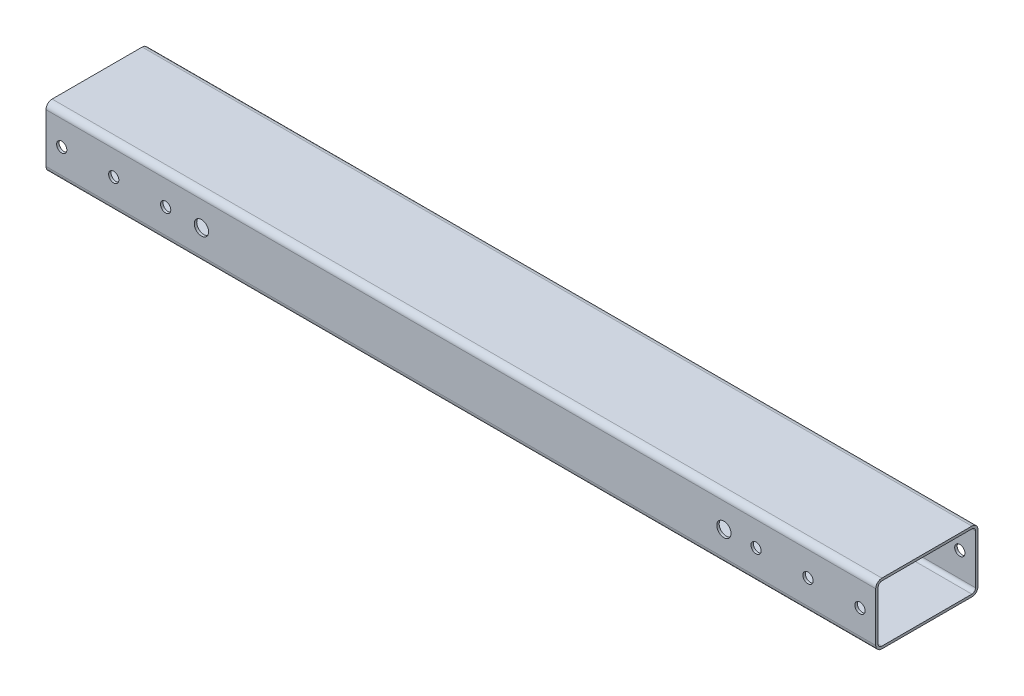
ISO-10303-21;
HEADER;
FILE_DESCRIPTION(('STEP AP214'),'2;1');
FILE_NAME('part.step','',(''),(''),'','','');
FILE_SCHEMA(('AUTOMOTIVE_DESIGN { 1 0 10303 214 1 1 1 1 }'));
ENDSEC;
DATA;
#1=APPLICATION_CONTEXT('core data for automotive mechanical design processes');
#2=APPLICATION_PROTOCOL_DEFINITION('international standard','automotive_design',2000,#1);
#3=PRODUCT_CONTEXT('',#1,'mechanical');
#4=PRODUCT('Part','Part','',(#3));
#5=PRODUCT_RELATED_PRODUCT_CATEGORY('part','',(#4));
#6=PRODUCT_DEFINITION_FORMATION('','',#4);
#7=PRODUCT_DEFINITION_CONTEXT('part definition',#1,'design');
#8=PRODUCT_DEFINITION('design','',#6,#7);
#9=PRODUCT_DEFINITION_SHAPE('','',#8);
#10=(LENGTH_UNIT() NAMED_UNIT(*) SI_UNIT(.MILLI.,.METRE.));
#11=(NAMED_UNIT(*) PLANE_ANGLE_UNIT() SI_UNIT($,.RADIAN.));
#12=(NAMED_UNIT(*) SI_UNIT($,.STERADIAN.) SOLID_ANGLE_UNIT());
#13=UNCERTAINTY_MEASURE_WITH_UNIT(LENGTH_MEASURE(1.E-05),#10,'distance_accuracy_value','');
#14=(GEOMETRIC_REPRESENTATION_CONTEXT(3) GLOBAL_UNCERTAINTY_ASSIGNED_CONTEXT((#13)) GLOBAL_UNIT_ASSIGNED_CONTEXT((#10,
#11,#12)) REPRESENTATION_CONTEXT('',''));
#15=CARTESIAN_POINT('',(0.,0.,0.));
#16=DIRECTION('',(0.,0.,1.));
#17=DIRECTION('',(1.,0.,0.));
#18=AXIS2_PLACEMENT_3D('',#15,#16,#17);
#19=CARTESIAN_POINT('',(405.6,12.,22.));
#20=DIRECTION('',(-1.,0.,0.));
#21=DIRECTION('',(0.,0.,1.));
#22=AXIS2_PLACEMENT_3D('',#19,#20,#21);
#23=CYLINDRICAL_SURFACE('',#22,3.);
#24=CARTESIAN_POINT('',(0.,12.,22.));
#25=DIRECTION('',(1.,0.,0.));
#26=DIRECTION('',(0.,0.,-1.));
#27=AXIS2_PLACEMENT_3D('',#24,#25,#26);
#28=CIRCLE('',#27,3.);
#29=CARTESIAN_POINT('',(0.,15.,22.));
#30=VERTEX_POINT('',#29);
#31=CARTESIAN_POINT('',(0.,12.,25.));
#32=VERTEX_POINT('',#31);
#33=EDGE_CURVE('E243',#30,#32,#28,.T.);
#34=ORIENTED_EDGE('',*,*,#33,.T.);
#35=DIRECTION('',(-1.,0.,0.));
#36=VECTOR('',#35,1.);
#37=CARTESIAN_POINT('',(405.6,12.,25.));
#38=LINE('',#37,#36);
#39=CARTESIAN_POINT('',(405.6,12.,25.));
#40=VERTEX_POINT('',#39);
#41=EDGE_CURVE('E12',#40,#32,#38,.T.);
#42=ORIENTED_EDGE('',*,*,#41,.F.);
#43=CARTESIAN_POINT('',(405.6,12.,22.));
#44=DIRECTION('',(1.,0.,0.));
#45=DIRECTION('',(0.,0.,-1.));
#46=AXIS2_PLACEMENT_3D('',#43,#44,#45);
#47=CIRCLE('',#46,3.);
#48=CARTESIAN_POINT('',(405.6,15.,22.));
#49=VERTEX_POINT('',#48);
#50=EDGE_CURVE('E401',#49,#40,#47,.T.);
#51=ORIENTED_EDGE('',*,*,#50,.F.);
#52=DIRECTION('',(-1.,0.,0.));
#53=VECTOR('',#52,1.);
#54=CARTESIAN_POINT('',(405.6,15.,22.));
#55=LINE('',#54,#53);
#56=EDGE_CURVE('E258',#49,#30,#55,.T.);
#57=ORIENTED_EDGE('',*,*,#56,.T.);
#58=EDGE_LOOP('',(#34,#42,#51,#57));
#59=FACE_BOUND('',#58,.T.);
#60=ADVANCED_FACE('F69',(#59),#23,.T.);
#61=CARTESIAN_POINT('',(405.6,12.,25.));
#62=DIRECTION('',(0.,0.,-1.));
#63=DIRECTION('',(-1.,0.,0.));
#64=AXIS2_PLACEMENT_3D('',#61,#62,#63);
#65=PLANE('',#64);
#66=CARTESIAN_POINT('',(75.9847050473196,1.11022302462516E-13,25.));
#67=DIRECTION('',(0.,0.,1.));
#68=DIRECTION('',(1.,0.,0.));
#69=AXIS2_PLACEMENT_3D('',#66,#67,#68);
#70=CIRCLE('',#69,3.50000000000002);
#71=CARTESIAN_POINT('',(79.4847050473196,1.11022302462516E-13,25.));
#72=VERTEX_POINT('',#71);
#73=EDGE_CURVE('E316',#72,#72,#70,.T.);
#74=ORIENTED_EDGE('',*,*,#73,.F.);
#75=EDGE_LOOP('',(#74));
#76=FACE_BOUND('',#75,.T.);
#77=CARTESIAN_POINT('',(331.38470504732,1.11022302462516E-13,25.));
#78=DIRECTION('',(0.,0.,1.));
#79=DIRECTION('',(1.,0.,0.));
#80=AXIS2_PLACEMENT_3D('',#77,#78,#79);
#81=CIRCLE('',#80,3.50000000000002);
#82=CARTESIAN_POINT('',(334.88470504732,1.11022302462516E-13,25.));
#83=VERTEX_POINT('',#82);
#84=EDGE_CURVE('E321',#83,#83,#81,.T.);
#85=ORIENTED_EDGE('',*,*,#84,.F.);
#86=EDGE_LOOP('',(#85));
#87=FACE_BOUND('',#86,.T.);
#88=CARTESIAN_POINT('',(33.1,0.,25.));
#89=DIRECTION('',(0.,0.,-1.));
#90=DIRECTION('',(-1.,0.,0.));
#91=AXIS2_PLACEMENT_3D('',#88,#89,#90);
#92=CIRCLE('',#91,2.5);
#93=CARTESIAN_POINT('',(30.6,0.,25.));
#94=VERTEX_POINT('',#93);
#95=EDGE_CURVE('E343',#94,#94,#92,.T.);
#96=ORIENTED_EDGE('',*,*,#95,.T.);
#97=EDGE_LOOP('',(#96));
#98=FACE_BOUND('',#97,.T.);
#99=CARTESIAN_POINT('',(7.7,0.,25.));
#100=DIRECTION('',(0.,0.,-1.));
#101=DIRECTION('',(-1.,0.,0.));
#102=AXIS2_PLACEMENT_3D('',#99,#100,#101);
#103=CIRCLE('',#102,2.5);
#104=CARTESIAN_POINT('',(5.2,0.,25.));
#105=VERTEX_POINT('',#104);
#106=EDGE_CURVE('E349',#105,#105,#103,.T.);
#107=ORIENTED_EDGE('',*,*,#106,.T.);
#108=EDGE_LOOP('',(#107));
#109=FACE_BOUND('',#108,.T.);
#110=CARTESIAN_POINT('',(397.9,0.,25.));
#111=DIRECTION('',(0.,0.,-1.));
#112=DIRECTION('',(1.,0.,0.));
#113=AXIS2_PLACEMENT_3D('',#110,#111,#112);
#114=CIRCLE('',#113,2.5000000000002);
#115=CARTESIAN_POINT('',(400.4,0.,25.));
#116=VERTEX_POINT('',#115);
#117=EDGE_CURVE('E355',#116,#116,#114,.T.);
#118=ORIENTED_EDGE('',*,*,#117,.T.);
#119=EDGE_LOOP('',(#118));
#120=FACE_BOUND('',#119,.T.);
#121=CARTESIAN_POINT('',(372.5,0.,25.));
#122=DIRECTION('',(0.,0.,-1.));
#123=DIRECTION('',(1.,0.,0.));
#124=AXIS2_PLACEMENT_3D('',#121,#122,#123);
#125=CIRCLE('',#124,2.50000000000002);
#126=CARTESIAN_POINT('',(375.,0.,25.));
#127=VERTEX_POINT('',#126);
#128=EDGE_CURVE('E336',#127,#127,#125,.T.);
#129=ORIENTED_EDGE('',*,*,#128,.T.);
#130=EDGE_LOOP('',(#129));
#131=FACE_BOUND('',#130,.T.);
#132=CARTESIAN_POINT('',(347.1,0.,25.));
#133=DIRECTION('',(0.,0.,-1.));
#134=DIRECTION('',(1.,0.,0.));
#135=AXIS2_PLACEMENT_3D('',#132,#133,#134);
#136=CIRCLE('',#135,2.50000000000002);
#137=CARTESIAN_POINT('',(349.6,0.,25.));
#138=VERTEX_POINT('',#137);
#139=EDGE_CURVE('E332',#138,#138,#136,.T.);
#140=ORIENTED_EDGE('',*,*,#139,.T.);
#141=EDGE_LOOP('',(#140));
#142=FACE_BOUND('',#141,.T.);
#143=CARTESIAN_POINT('',(58.5,0.,25.));
#144=DIRECTION('',(0.,0.,-1.));
#145=DIRECTION('',(-1.,0.,0.));
#146=AXIS2_PLACEMENT_3D('',#143,#144,#145);
#147=CIRCLE('',#146,2.5);
#148=CARTESIAN_POINT('',(56.,0.,25.));
#149=VERTEX_POINT('',#148);
#150=EDGE_CURVE('E288',#149,#149,#147,.T.);
#151=ORIENTED_EDGE('',*,*,#150,.T.);
#152=EDGE_LOOP('',(#151));
#153=FACE_BOUND('',#152,.T.);
#154=DIRECTION('',(0.,-1.,0.));
#155=VECTOR('',#154,1.);
#156=CARTESIAN_POINT('',(0.,12.,25.));
#157=LINE('',#156,#155);
#158=CARTESIAN_POINT('',(0.,-12.,25.));
#159=VERTEX_POINT('',#158);
#160=EDGE_CURVE('E246',#32,#159,#157,.T.);
#161=ORIENTED_EDGE('',*,*,#160,.T.);
#162=DIRECTION('',(-1.,0.,0.));
#163=VECTOR('',#162,1.);
#164=CARTESIAN_POINT('',(405.6,-12.,25.));
#165=LINE('',#164,#163);
#166=CARTESIAN_POINT('',(405.6,-12.,25.));
#167=VERTEX_POINT('',#166);
#168=EDGE_CURVE('E79',#167,#159,#165,.T.);
#169=ORIENTED_EDGE('',*,*,#168,.F.);
#170=DIRECTION('',(0.,-1.,0.));
#171=VECTOR('',#170,1.);
#172=CARTESIAN_POINT('',(405.6,12.,25.));
#173=LINE('',#172,#171);
#174=EDGE_CURVE('E403',#40,#167,#173,.T.);
#175=ORIENTED_EDGE('',*,*,#174,.F.);
#176=ORIENTED_EDGE('',*,*,#41,.T.);
#177=EDGE_LOOP('',(#161,#169,#175,#176));
#178=FACE_BOUND('',#177,.T.);
#179=ADVANCED_FACE('F441',(#76,#87,#98,#109,#120,#131,#142,#153,#178),#65,.F.);
#180=CARTESIAN_POINT('',(405.6,-12.,22.));
#181=DIRECTION('',(-1.,0.,0.));
#182=DIRECTION('',(0.,0.,1.));
#183=AXIS2_PLACEMENT_3D('',#180,#181,#182);
#184=CYLINDRICAL_SURFACE('',#183,3.);
#185=CARTESIAN_POINT('',(0.,-12.,22.));
#186=DIRECTION('',(1.,0.,0.));
#187=DIRECTION('',(0.,0.,-1.));
#188=AXIS2_PLACEMENT_3D('',#185,#186,#187);
#189=CIRCLE('',#188,3.);
#190=CARTESIAN_POINT('',(0.,-15.,22.));
#191=VERTEX_POINT('',#190);
#192=EDGE_CURVE('E248',#159,#191,#189,.T.);
#193=ORIENTED_EDGE('',*,*,#192,.T.);
#194=DIRECTION('',(-1.,0.,0.));
#195=VECTOR('',#194,1.);
#196=CARTESIAN_POINT('',(405.6,-15.,22.));
#197=LINE('',#196,#195);
#198=CARTESIAN_POINT('',(405.6,-15.,22.));
#199=VERTEX_POINT('',#198);
#200=EDGE_CURVE('E265',#199,#191,#197,.T.);
#201=ORIENTED_EDGE('',*,*,#200,.F.);
#202=CARTESIAN_POINT('',(405.6,-12.,22.));
#203=DIRECTION('',(1.,0.,0.));
#204=DIRECTION('',(0.,0.,-1.));
#205=AXIS2_PLACEMENT_3D('',#202,#203,#204);
#206=CIRCLE('',#205,3.);
#207=EDGE_CURVE('E405',#167,#199,#206,.T.);
#208=ORIENTED_EDGE('',*,*,#207,.F.);
#209=ORIENTED_EDGE('',*,*,#168,.T.);
#210=EDGE_LOOP('',(#193,#201,#208,#209));
#211=FACE_BOUND('',#210,.T.);
#212=ADVANCED_FACE('F447',(#211),#184,.T.);
#213=CARTESIAN_POINT('',(405.6,-15.,-22.));
#214=DIRECTION('',(0.,1.,0.));
#215=DIRECTION('',(0.,0.,1.));
#216=AXIS2_PLACEMENT_3D('',#213,#214,#215);
#217=PLANE('',#216);
#218=DIRECTION('',(0.,0.,-1.));
#219=VECTOR('',#218,1.);
#220=CARTESIAN_POINT('',(0.,-15.,-22.));
#221=LINE('',#220,#219);
#222=CARTESIAN_POINT('',(0.,-15.,-22.));
#223=VERTEX_POINT('',#222);
#224=EDGE_CURVE('E250',#191,#223,#221,.T.);
#225=ORIENTED_EDGE('',*,*,#224,.T.);
#226=DIRECTION('',(-1.,0.,0.));
#227=VECTOR('',#226,1.);
#228=CARTESIAN_POINT('',(405.6,-15.,-22.));
#229=LINE('',#228,#227);
#230=CARTESIAN_POINT('',(405.6,-15.,-22.));
#231=VERTEX_POINT('',#230);
#232=EDGE_CURVE('E262',#231,#223,#229,.T.);
#233=ORIENTED_EDGE('',*,*,#232,.F.);
#234=DIRECTION('',(0.,0.,-1.));
#235=VECTOR('',#234,1.);
#236=CARTESIAN_POINT('',(405.6,-15.,-22.));
#237=LINE('',#236,#235);
#238=EDGE_CURVE('E407',#199,#231,#237,.T.);
#239=ORIENTED_EDGE('',*,*,#238,.F.);
#240=ORIENTED_EDGE('',*,*,#200,.T.);
#241=EDGE_LOOP('',(#225,#233,#239,#240));
#242=FACE_BOUND('',#241,.T.);
#243=ADVANCED_FACE('F413',(#242),#217,.F.);
#244=CARTESIAN_POINT('',(405.6,-12.,-22.));
#245=DIRECTION('',(-1.,0.,0.));
#246=DIRECTION('',(0.,0.,1.));
#247=AXIS2_PLACEMENT_3D('',#244,#245,#246);
#248=CYLINDRICAL_SURFACE('',#247,3.);
#249=CARTESIAN_POINT('',(0.,-12.,-22.));
#250=DIRECTION('',(1.,0.,0.));
#251=DIRECTION('',(0.,0.,-1.));
#252=AXIS2_PLACEMENT_3D('',#249,#250,#251);
#253=CIRCLE('',#252,3.);
#254=CARTESIAN_POINT('',(0.,-12.,-25.));
#255=VERTEX_POINT('',#254);
#256=EDGE_CURVE('E252',#223,#255,#253,.T.);
#257=ORIENTED_EDGE('',*,*,#256,.T.);
#258=DIRECTION('',(-1.,0.,0.));
#259=VECTOR('',#258,1.);
#260=CARTESIAN_POINT('',(405.6,-12.,-25.));
#261=LINE('',#260,#259);
#262=CARTESIAN_POINT('',(405.6,-12.,-25.));
#263=VERTEX_POINT('',#262);
#264=EDGE_CURVE('E209',#263,#255,#261,.T.);
#265=ORIENTED_EDGE('',*,*,#264,.F.);
#266=CARTESIAN_POINT('',(405.6,-12.,-22.));
#267=DIRECTION('',(1.,0.,0.));
#268=DIRECTION('',(0.,0.,-1.));
#269=AXIS2_PLACEMENT_3D('',#266,#267,#268);
#270=CIRCLE('',#269,3.);
#271=EDGE_CURVE('E200',#231,#263,#270,.T.);
#272=ORIENTED_EDGE('',*,*,#271,.F.);
#273=ORIENTED_EDGE('',*,*,#232,.T.);
#274=EDGE_LOOP('',(#257,#265,#272,#273));
#275=FACE_BOUND('',#274,.T.);
#276=ADVANCED_FACE('F417',(#275),#248,.T.);
#277=CARTESIAN_POINT('',(405.6,-12.,-25.));
#278=DIRECTION('',(0.,0.,1.));
#279=DIRECTION('',(1.,0.,0.));
#280=AXIS2_PLACEMENT_3D('',#277,#278,#279);
#281=PLANE('',#280);
#282=CARTESIAN_POINT('',(75.9847050473196,1.11022302462516E-13,-25.));
#283=DIRECTION('',(0.,0.,1.));
#284=DIRECTION('',(1.,0.,0.));
#285=AXIS2_PLACEMENT_3D('',#282,#283,#284);
#286=CIRCLE('',#285,3.50000000000002);
#287=CARTESIAN_POINT('',(79.4847050473196,1.11022302462516E-13,-25.));
#288=VERTEX_POINT('',#287);
#289=EDGE_CURVE('E310',#288,#288,#286,.T.);
#290=ORIENTED_EDGE('',*,*,#289,.T.);
#291=EDGE_LOOP('',(#290));
#292=FACE_BOUND('',#291,.T.);
#293=CARTESIAN_POINT('',(331.38470504732,1.11022302462516E-13,-25.));
#294=DIRECTION('',(0.,0.,1.));
#295=DIRECTION('',(1.,0.,0.));
#296=AXIS2_PLACEMENT_3D('',#293,#294,#295);
#297=CIRCLE('',#296,3.50000000000002);
#298=CARTESIAN_POINT('',(334.88470504732,1.11022302462516E-13,-25.));
#299=VERTEX_POINT('',#298);
#300=EDGE_CURVE('E326',#299,#299,#297,.T.);
#301=ORIENTED_EDGE('',*,*,#300,.T.);
#302=EDGE_LOOP('',(#301));
#303=FACE_BOUND('',#302,.T.);
#304=CARTESIAN_POINT('',(33.1,0.,-25.));
#305=DIRECTION('',(0.,0.,-1.));
#306=DIRECTION('',(-1.,0.,0.));
#307=AXIS2_PLACEMENT_3D('',#304,#305,#306);
#308=CIRCLE('',#307,2.5);
#309=CARTESIAN_POINT('',(30.6,0.,-25.));
#310=VERTEX_POINT('',#309);
#311=EDGE_CURVE('E339',#310,#310,#308,.T.);
#312=ORIENTED_EDGE('',*,*,#311,.F.);
#313=EDGE_LOOP('',(#312));
#314=FACE_BOUND('',#313,.T.);
#315=CARTESIAN_POINT('',(7.7,0.,-25.));
#316=DIRECTION('',(0.,0.,-1.));
#317=DIRECTION('',(-1.,0.,0.));
#318=AXIS2_PLACEMENT_3D('',#315,#316,#317);
#319=CIRCLE('',#318,2.5);
#320=CARTESIAN_POINT('',(5.2,0.,-25.));
#321=VERTEX_POINT('',#320);
#322=EDGE_CURVE('E346',#321,#321,#319,.T.);
#323=ORIENTED_EDGE('',*,*,#322,.F.);
#324=EDGE_LOOP('',(#323));
#325=FACE_BOUND('',#324,.T.);
#326=CARTESIAN_POINT('',(397.9,0.,-25.));
#327=DIRECTION('',(0.,0.,-1.));
#328=DIRECTION('',(1.,0.,0.));
#329=AXIS2_PLACEMENT_3D('',#326,#327,#328);
#330=CIRCLE('',#329,2.5000000000002);
#331=CARTESIAN_POINT('',(400.4,0.,-25.));
#332=VERTEX_POINT('',#331);
#333=EDGE_CURVE('E352',#332,#332,#330,.T.);
#334=ORIENTED_EDGE('',*,*,#333,.F.);
#335=EDGE_LOOP('',(#334));
#336=FACE_BOUND('',#335,.T.);
#337=CARTESIAN_POINT('',(372.5,0.,-25.));
#338=DIRECTION('',(0.,0.,-1.));
#339=DIRECTION('',(1.,0.,0.));
#340=AXIS2_PLACEMENT_3D('',#337,#338,#339);
#341=CIRCLE('',#340,2.50000000000002);
#342=CARTESIAN_POINT('',(375.,0.,-25.));
#343=VERTEX_POINT('',#342);
#344=EDGE_CURVE('E358',#343,#343,#341,.T.);
#345=ORIENTED_EDGE('',*,*,#344,.F.);
#346=EDGE_LOOP('',(#345));
#347=FACE_BOUND('',#346,.T.);
#348=CARTESIAN_POINT('',(347.1,0.,-25.));
#349=DIRECTION('',(0.,0.,-1.));
#350=DIRECTION('',(1.,0.,0.));
#351=AXIS2_PLACEMENT_3D('',#348,#349,#350);
#352=CIRCLE('',#351,2.50000000000002);
#353=CARTESIAN_POINT('',(349.6,0.,-25.));
#354=VERTEX_POINT('',#353);
#355=EDGE_CURVE('E333',#354,#354,#352,.T.);
#356=ORIENTED_EDGE('',*,*,#355,.F.);
#357=EDGE_LOOP('',(#356));
#358=FACE_BOUND('',#357,.T.);
#359=CARTESIAN_POINT('',(58.5,0.,-25.));
#360=DIRECTION('',(0.,0.,-1.));
#361=DIRECTION('',(-1.,0.,0.));
#362=AXIS2_PLACEMENT_3D('',#359,#360,#361);
#363=CIRCLE('',#362,2.5);
#364=CARTESIAN_POINT('',(56.,0.,-25.));
#365=VERTEX_POINT('',#364);
#366=EDGE_CURVE('E342',#365,#365,#363,.T.);
#367=ORIENTED_EDGE('',*,*,#366,.F.);
#368=EDGE_LOOP('',(#367));
#369=FACE_BOUND('',#368,.T.);
#370=DIRECTION('',(0.,1.,0.));
#371=VECTOR('',#370,1.);
#372=CARTESIAN_POINT('',(0.,-12.,-25.));
#373=LINE('',#372,#371);
#374=CARTESIAN_POINT('',(0.,12.,-25.));
#375=VERTEX_POINT('',#374);
#376=EDGE_CURVE('E208',#255,#375,#373,.T.);
#377=ORIENTED_EDGE('',*,*,#376,.T.);
#378=DIRECTION('',(-1.,0.,0.));
#379=VECTOR('',#378,1.);
#380=CARTESIAN_POINT('',(405.6,12.,-25.));
#381=LINE('',#380,#379);
#382=CARTESIAN_POINT('',(405.6,12.,-25.));
#383=VERTEX_POINT('',#382);
#384=EDGE_CURVE('E205',#383,#375,#381,.T.);
#385=ORIENTED_EDGE('',*,*,#384,.F.);
#386=DIRECTION('',(0.,1.,0.));
#387=VECTOR('',#386,1.);
#388=CARTESIAN_POINT('',(405.6,-12.,-25.));
#389=LINE('',#388,#387);
#390=EDGE_CURVE('E194',#263,#383,#389,.T.);
#391=ORIENTED_EDGE('',*,*,#390,.F.);
#392=ORIENTED_EDGE('',*,*,#264,.T.);
#393=EDGE_LOOP('',(#377,#385,#391,#392));
#394=FACE_BOUND('',#393,.T.);
#395=ADVANCED_FACE('F206',(#292,#303,#314,#325,#336,#347,#358,#369,#394),#281,.F.);
#396=CARTESIAN_POINT('',(405.6,12.,-22.));
#397=DIRECTION('',(-1.,0.,0.));
#398=DIRECTION('',(0.,0.,1.));
#399=AXIS2_PLACEMENT_3D('',#396,#397,#398);
#400=CYLINDRICAL_SURFACE('',#399,3.);
#401=CARTESIAN_POINT('',(0.,12.,-22.));
#402=DIRECTION('',(1.,0.,0.));
#403=DIRECTION('',(0.,0.,-1.));
#404=AXIS2_PLACEMENT_3D('',#401,#402,#403);
#405=CIRCLE('',#404,3.);
#406=CARTESIAN_POINT('',(0.,15.,-22.));
#407=VERTEX_POINT('',#406);
#408=EDGE_CURVE('E141',#375,#407,#405,.T.);
#409=ORIENTED_EDGE('',*,*,#408,.T.);
#410=DIRECTION('',(-1.,0.,0.));
#411=VECTOR('',#410,1.);
#412=CARTESIAN_POINT('',(405.6,15.,-22.));
#413=LINE('',#412,#411);
#414=CARTESIAN_POINT('',(405.6,15.,-22.));
#415=VERTEX_POINT('',#414);
#416=EDGE_CURVE('E210',#415,#407,#413,.T.);
#417=ORIENTED_EDGE('',*,*,#416,.F.);
#418=CARTESIAN_POINT('',(405.6,12.,-22.));
#419=DIRECTION('',(1.,0.,0.));
#420=DIRECTION('',(0.,0.,-1.));
#421=AXIS2_PLACEMENT_3D('',#418,#419,#420);
#422=CIRCLE('',#421,3.);
#423=EDGE_CURVE('E198',#383,#415,#422,.T.);
#424=ORIENTED_EDGE('',*,*,#423,.F.);
#425=ORIENTED_EDGE('',*,*,#384,.T.);
#426=EDGE_LOOP('',(#409,#417,#424,#425));
#427=FACE_BOUND('',#426,.T.);
#428=ADVANCED_FACE('F212',(#427),#400,.T.);
#429=CARTESIAN_POINT('',(405.6,-12.,22.));
#430=DIRECTION('',(-1.,0.,0.));
#431=DIRECTION('',(0.,0.,1.));
#432=AXIS2_PLACEMENT_3D('',#429,#430,#431);
#433=CYLINDRICAL_SURFACE('',#432,1.8);
#434=CARTESIAN_POINT('',(0.,-12.,22.));
#435=DIRECTION('',(1.,0.,0.));
#436=DIRECTION('',(0.,0.,-1.));
#437=AXIS2_PLACEMENT_3D('',#434,#435,#436);
#438=CIRCLE('',#437,1.8);
#439=CARTESIAN_POINT('',(0.,-12.,23.8));
#440=VERTEX_POINT('',#439);
#441=CARTESIAN_POINT('',(0.,-13.8,22.));
#442=VERTEX_POINT('',#441);
#443=EDGE_CURVE('E218',#440,#442,#438,.T.);
#444=ORIENTED_EDGE('',*,*,#443,.F.);
#445=DIRECTION('',(-1.,0.,0.));
#446=VECTOR('',#445,1.);
#447=CARTESIAN_POINT('',(405.6,-12.,23.8));
#448=LINE('',#447,#446);
#449=CARTESIAN_POINT('',(405.6,-12.,23.8));
#450=VERTEX_POINT('',#449);
#451=EDGE_CURVE('E155',#450,#440,#448,.T.);
#452=ORIENTED_EDGE('',*,*,#451,.F.);
#453=CARTESIAN_POINT('',(405.6,-12.,22.));
#454=DIRECTION('',(1.,0.,0.));
#455=DIRECTION('',(0.,0.,-1.));
#456=AXIS2_PLACEMENT_3D('',#453,#454,#455);
#457=CIRCLE('',#456,1.8);
#458=CARTESIAN_POINT('',(405.6,-13.8,22.));
#459=VERTEX_POINT('',#458);
#460=EDGE_CURVE('E257',#450,#459,#457,.T.);
#461=ORIENTED_EDGE('',*,*,#460,.T.);
#462=DIRECTION('',(-1.,0.,0.));
#463=VECTOR('',#462,1.);
#464=CARTESIAN_POINT('',(405.6,-13.8,22.));
#465=LINE('',#464,#463);
#466=EDGE_CURVE('E214',#459,#442,#465,.T.);
#467=ORIENTED_EDGE('',*,*,#466,.T.);
#468=EDGE_LOOP('',(#444,#452,#461,#467));
#469=FACE_BOUND('',#468,.T.);
#470=ADVANCED_FACE('F71',(#469),#433,.F.);
#471=CARTESIAN_POINT('',(405.6,12.,23.8));
#472=DIRECTION('',(0.,0.,-1.));
#473=DIRECTION('',(-1.,0.,0.));
#474=AXIS2_PLACEMENT_3D('',#471,#472,#473);
#475=PLANE('',#474);
#476=CARTESIAN_POINT('',(75.9847050473196,1.11022302462516E-13,23.8));
#477=DIRECTION('',(0.,0.,-1.));
#478=DIRECTION('',(-1.,0.,0.));
#479=AXIS2_PLACEMENT_3D('',#476,#477,#478);
#480=CIRCLE('',#479,3.50000000000002);
#481=CARTESIAN_POINT('',(72.4847050473196,1.11022302462516E-13,23.8));
#482=VERTEX_POINT('',#481);
#483=EDGE_CURVE('E329',#482,#482,#480,.T.);
#484=ORIENTED_EDGE('',*,*,#483,.F.);
#485=EDGE_LOOP('',(#484));
#486=FACE_BOUND('',#485,.T.);
#487=CARTESIAN_POINT('',(331.38470504732,1.11022302462516E-13,23.8));
#488=DIRECTION('',(0.,0.,-1.));
#489=DIRECTION('',(-1.,0.,0.));
#490=AXIS2_PLACEMENT_3D('',#487,#488,#489);
#491=CIRCLE('',#490,3.50000000000002);
#492=CARTESIAN_POINT('',(327.88470504732,1.11022302462516E-13,23.8));
#493=VERTEX_POINT('',#492);
#494=EDGE_CURVE('E309',#493,#493,#491,.T.);
#495=ORIENTED_EDGE('',*,*,#494,.F.);
#496=EDGE_LOOP('',(#495));
#497=FACE_BOUND('',#496,.T.);
#498=CARTESIAN_POINT('',(33.1,0.,23.8));
#499=DIRECTION('',(0.,0.,-1.));
#500=DIRECTION('',(-1.,0.,0.));
#501=AXIS2_PLACEMENT_3D('',#498,#499,#500);
#502=CIRCLE('',#501,2.5);
#503=CARTESIAN_POINT('',(30.6,0.,23.8));
#504=VERTEX_POINT('',#503);
#505=EDGE_CURVE('E222',#504,#504,#502,.T.);
#506=ORIENTED_EDGE('',*,*,#505,.F.);
#507=EDGE_LOOP('',(#506));
#508=FACE_BOUND('',#507,.T.);
#509=CARTESIAN_POINT('',(7.7,0.,23.8));
#510=DIRECTION('',(0.,0.,-1.));
#511=DIRECTION('',(-1.,0.,0.));
#512=AXIS2_PLACEMENT_3D('',#509,#510,#511);
#513=CIRCLE('',#512,2.5);
#514=CARTESIAN_POINT('',(5.2,0.,23.8));
#515=VERTEX_POINT('',#514);
#516=EDGE_CURVE('E304',#515,#515,#513,.T.);
#517=ORIENTED_EDGE('',*,*,#516,.F.);
#518=EDGE_LOOP('',(#517));
#519=FACE_BOUND('',#518,.T.);
#520=CARTESIAN_POINT('',(397.9,0.,23.8));
#521=DIRECTION('',(0.,0.,-1.));
#522=DIRECTION('',(-1.,0.,0.));
#523=AXIS2_PLACEMENT_3D('',#520,#521,#522);
#524=CIRCLE('',#523,2.5000000000002);
#525=CARTESIAN_POINT('',(395.4,0.,23.8));
#526=VERTEX_POINT('',#525);
#527=EDGE_CURVE('E300',#526,#526,#524,.T.);
#528=ORIENTED_EDGE('',*,*,#527,.F.);
#529=EDGE_LOOP('',(#528));
#530=FACE_BOUND('',#529,.T.);
#531=CARTESIAN_POINT('',(372.5,0.,23.8));
#532=DIRECTION('',(0.,0.,-1.));
#533=DIRECTION('',(-1.,0.,0.));
#534=AXIS2_PLACEMENT_3D('',#531,#532,#533);
#535=CIRCLE('',#534,2.50000000000002);
#536=CARTESIAN_POINT('',(370.,0.,23.8));
#537=VERTEX_POINT('',#536);
#538=EDGE_CURVE('E296',#537,#537,#535,.T.);
#539=ORIENTED_EDGE('',*,*,#538,.F.);
#540=EDGE_LOOP('',(#539));
#541=FACE_BOUND('',#540,.T.);
#542=CARTESIAN_POINT('',(347.1,0.,23.8));
#543=DIRECTION('',(0.,0.,-1.));
#544=DIRECTION('',(-1.,0.,0.));
#545=AXIS2_PLACEMENT_3D('',#542,#543,#544);
#546=CIRCLE('',#545,2.50000000000002);
#547=CARTESIAN_POINT('',(344.6,0.,23.8));
#548=VERTEX_POINT('',#547);
#549=EDGE_CURVE('E292',#548,#548,#546,.T.);
#550=ORIENTED_EDGE('',*,*,#549,.F.);
#551=EDGE_LOOP('',(#550));
#552=FACE_BOUND('',#551,.T.);
#553=CARTESIAN_POINT('',(58.5,0.,23.8));
#554=DIRECTION('',(0.,0.,-1.));
#555=DIRECTION('',(-1.,0.,0.));
#556=AXIS2_PLACEMENT_3D('',#553,#554,#555);
#557=CIRCLE('',#556,2.5);
#558=CARTESIAN_POINT('',(56.,0.,23.8));
#559=VERTEX_POINT('',#558);
#560=EDGE_CURVE('E287',#559,#559,#557,.T.);
#561=ORIENTED_EDGE('',*,*,#560,.F.);
#562=EDGE_LOOP('',(#561));
#563=FACE_BOUND('',#562,.T.);
#564=DIRECTION('',(0.,-1.,0.));
#565=VECTOR('',#564,1.);
#566=CARTESIAN_POINT('',(0.,12.,23.8));
#567=LINE('',#566,#565);
#568=CARTESIAN_POINT('',(0.,12.,23.8));
#569=VERTEX_POINT('',#568);
#570=EDGE_CURVE('E221',#569,#440,#567,.T.);
#571=ORIENTED_EDGE('',*,*,#570,.F.);
#572=DIRECTION('',(-1.,0.,0.));
#573=VECTOR('',#572,1.);
#574=CARTESIAN_POINT('',(405.6,12.,23.8));
#575=LINE('',#574,#573);
#576=CARTESIAN_POINT('',(405.6,12.,23.8));
#577=VERTEX_POINT('',#576);
#578=EDGE_CURVE('E281',#577,#569,#575,.T.);
#579=ORIENTED_EDGE('',*,*,#578,.F.);
#580=DIRECTION('',(0.,-1.,0.));
#581=VECTOR('',#580,1.);
#582=CARTESIAN_POINT('',(405.6,12.,23.8));
#583=LINE('',#582,#581);
#584=EDGE_CURVE('E380',#577,#450,#583,.T.);
#585=ORIENTED_EDGE('',*,*,#584,.T.);
#586=ORIENTED_EDGE('',*,*,#451,.T.);
#587=EDGE_LOOP('',(#571,#579,#585,#586));
#588=FACE_BOUND('',#587,.T.);
#589=ADVANCED_FACE('F469',(#486,#497,#508,#519,#530,#541,#552,#563,#588),#475,.T.);
#590=CARTESIAN_POINT('',(405.6,12.,22.));
#591=DIRECTION('',(-1.,0.,0.));
#592=DIRECTION('',(0.,0.,1.));
#593=AXIS2_PLACEMENT_3D('',#590,#591,#592);
#594=CYLINDRICAL_SURFACE('',#593,1.8);
#595=CARTESIAN_POINT('',(0.,12.,22.));
#596=DIRECTION('',(1.,0.,0.));
#597=DIRECTION('',(0.,0.,-1.));
#598=AXIS2_PLACEMENT_3D('',#595,#596,#597);
#599=CIRCLE('',#598,1.8);
#600=CARTESIAN_POINT('',(0.,13.8,22.));
#601=VERTEX_POINT('',#600);
#602=EDGE_CURVE('E225',#601,#569,#599,.T.);
#603=ORIENTED_EDGE('',*,*,#602,.F.);
#604=DIRECTION('',(-1.,0.,0.));
#605=VECTOR('',#604,1.);
#606=CARTESIAN_POINT('',(405.6,13.8,22.));
#607=LINE('',#606,#605);
#608=CARTESIAN_POINT('',(405.6,13.8,22.));
#609=VERTEX_POINT('',#608);
#610=EDGE_CURVE('E279',#609,#601,#607,.T.);
#611=ORIENTED_EDGE('',*,*,#610,.F.);
#612=CARTESIAN_POINT('',(405.6,12.,22.));
#613=DIRECTION('',(1.,0.,0.));
#614=DIRECTION('',(0.,0.,-1.));
#615=AXIS2_PLACEMENT_3D('',#612,#613,#614);
#616=CIRCLE('',#615,1.8);
#617=EDGE_CURVE('E383',#609,#577,#616,.T.);
#618=ORIENTED_EDGE('',*,*,#617,.T.);
#619=ORIENTED_EDGE('',*,*,#578,.T.);
#620=EDGE_LOOP('',(#603,#611,#618,#619));
#621=FACE_BOUND('',#620,.T.);
#622=ADVANCED_FACE('F466',(#621),#594,.F.);
#623=CARTESIAN_POINT('',(405.6,13.8,22.));
#624=DIRECTION('',(0.,-1.,0.));
#625=DIRECTION('',(0.,0.,-1.));
#626=AXIS2_PLACEMENT_3D('',#623,#624,#625);
#627=PLANE('',#626);
#628=DIRECTION('',(0.,0.,1.));
#629=VECTOR('',#628,1.);
#630=CARTESIAN_POINT('',(0.,13.8,22.));
#631=LINE('',#630,#629);
#632=CARTESIAN_POINT('',(0.,13.8,-22.));
#633=VERTEX_POINT('',#632);
#634=EDGE_CURVE('E228',#633,#601,#631,.T.);
#635=ORIENTED_EDGE('',*,*,#634,.F.);
#636=DIRECTION('',(-1.,0.,0.));
#637=VECTOR('',#636,1.);
#638=CARTESIAN_POINT('',(405.6,13.8,-22.));
#639=LINE('',#638,#637);
#640=CARTESIAN_POINT('',(405.6,13.8,-22.));
#641=VERTEX_POINT('',#640);
#642=EDGE_CURVE('E277',#641,#633,#639,.T.);
#643=ORIENTED_EDGE('',*,*,#642,.F.);
#644=DIRECTION('',(0.,0.,1.));
#645=VECTOR('',#644,1.);
#646=CARTESIAN_POINT('',(405.6,13.8,22.));
#647=LINE('',#646,#645);
#648=EDGE_CURVE('E386',#641,#609,#647,.T.);
#649=ORIENTED_EDGE('',*,*,#648,.T.);
#650=ORIENTED_EDGE('',*,*,#610,.T.);
#651=EDGE_LOOP('',(#635,#643,#649,#650));
#652=FACE_BOUND('',#651,.T.);
#653=ADVANCED_FACE('F462',(#652),#627,.T.);
#654=CARTESIAN_POINT('',(405.6,12.,-22.));
#655=DIRECTION('',(-1.,0.,0.));
#656=DIRECTION('',(0.,0.,1.));
#657=AXIS2_PLACEMENT_3D('',#654,#655,#656);
#658=CYLINDRICAL_SURFACE('',#657,1.8);
#659=CARTESIAN_POINT('',(0.,12.,-22.));
#660=DIRECTION('',(1.,0.,0.));
#661=DIRECTION('',(0.,0.,-1.));
#662=AXIS2_PLACEMENT_3D('',#659,#660,#661);
#663=CIRCLE('',#662,1.8);
#664=CARTESIAN_POINT('',(0.,12.,-23.8));
#665=VERTEX_POINT('',#664);
#666=EDGE_CURVE('E231',#665,#633,#663,.T.);
#667=ORIENTED_EDGE('',*,*,#666,.F.);
#668=DIRECTION('',(-1.,0.,0.));
#669=VECTOR('',#668,1.);
#670=CARTESIAN_POINT('',(405.6,12.,-23.8));
#671=LINE('',#670,#669);
#672=CARTESIAN_POINT('',(405.6,12.,-23.8));
#673=VERTEX_POINT('',#672);
#674=EDGE_CURVE('E275',#673,#665,#671,.T.);
#675=ORIENTED_EDGE('',*,*,#674,.F.);
#676=CARTESIAN_POINT('',(405.6,12.,-22.));
#677=DIRECTION('',(1.,0.,0.));
#678=DIRECTION('',(0.,0.,-1.));
#679=AXIS2_PLACEMENT_3D('',#676,#677,#678);
#680=CIRCLE('',#679,1.8);
#681=EDGE_CURVE('E389',#673,#641,#680,.T.);
#682=ORIENTED_EDGE('',*,*,#681,.T.);
#683=ORIENTED_EDGE('',*,*,#642,.T.);
#684=EDGE_LOOP('',(#667,#675,#682,#683));
#685=FACE_BOUND('',#684,.T.);
#686=ADVANCED_FACE('F458',(#685),#658,.F.);
#687=CARTESIAN_POINT('',(405.6,-12.,-23.8));
#688=DIRECTION('',(0.,0.,1.));
#689=DIRECTION('',(1.,0.,0.));
#690=AXIS2_PLACEMENT_3D('',#687,#688,#689);
#691=PLANE('',#690);
#692=CARTESIAN_POINT('',(75.9847050473196,1.11022302462516E-13,-23.8));
#693=DIRECTION('',(0.,0.,1.));
#694=DIRECTION('',(1.,0.,0.));
#695=AXIS2_PLACEMENT_3D('',#692,#693,#694);
#696=CIRCLE('',#695,3.50000000000002);
#697=CARTESIAN_POINT('',(79.4847050473196,1.11022302462516E-13,-23.8));
#698=VERTEX_POINT('',#697);
#699=EDGE_CURVE('E73',#698,#698,#696,.T.);
#700=ORIENTED_EDGE('',*,*,#699,.F.);
#701=EDGE_LOOP('',(#700));
#702=FACE_BOUND('',#701,.T.);
#703=CARTESIAN_POINT('',(331.38470504732,1.11022302462516E-13,-23.8));
#704=DIRECTION('',(0.,0.,1.));
#705=DIRECTION('',(1.,0.,0.));
#706=AXIS2_PLACEMENT_3D('',#703,#704,#705);
#707=CIRCLE('',#706,3.50000000000002);
#708=CARTESIAN_POINT('',(334.88470504732,1.11022302462516E-13,-23.8));
#709=VERTEX_POINT('',#708);
#710=EDGE_CURVE('E307',#709,#709,#707,.T.);
#711=ORIENTED_EDGE('',*,*,#710,.F.);
#712=EDGE_LOOP('',(#711));
#713=FACE_BOUND('',#712,.T.);
#714=CARTESIAN_POINT('',(33.1,0.,-23.8));
#715=DIRECTION('',(0.,0.,1.));
#716=DIRECTION('',(1.,0.,0.));
#717=AXIS2_PLACEMENT_3D('',#714,#715,#716);
#718=CIRCLE('',#717,2.5);
#719=CARTESIAN_POINT('',(35.6,0.,-23.8));
#720=VERTEX_POINT('',#719);
#721=EDGE_CURVE('E305',#720,#720,#718,.T.);
#722=ORIENTED_EDGE('',*,*,#721,.F.);
#723=EDGE_LOOP('',(#722));
#724=FACE_BOUND('',#723,.T.);
#725=CARTESIAN_POINT('',(7.7,0.,-23.8));
#726=DIRECTION('',(0.,0.,1.));
#727=DIRECTION('',(1.,0.,0.));
#728=AXIS2_PLACEMENT_3D('',#725,#726,#727);
#729=CIRCLE('',#728,2.5);
#730=CARTESIAN_POINT('',(10.2,0.,-23.8));
#731=VERTEX_POINT('',#730);
#732=EDGE_CURVE('E301',#731,#731,#729,.T.);
#733=ORIENTED_EDGE('',*,*,#732,.F.);
#734=EDGE_LOOP('',(#733));
#735=FACE_BOUND('',#734,.T.);
#736=CARTESIAN_POINT('',(397.9,0.,-23.8));
#737=DIRECTION('',(0.,0.,1.));
#738=DIRECTION('',(1.,0.,0.));
#739=AXIS2_PLACEMENT_3D('',#736,#737,#738);
#740=CIRCLE('',#739,2.5000000000002);
#741=CARTESIAN_POINT('',(400.4,0.,-23.8));
#742=VERTEX_POINT('',#741);
#743=EDGE_CURVE('E297',#742,#742,#740,.T.);
#744=ORIENTED_EDGE('',*,*,#743,.F.);
#745=EDGE_LOOP('',(#744));
#746=FACE_BOUND('',#745,.T.);
#747=CARTESIAN_POINT('',(372.5,0.,-23.8));
#748=DIRECTION('',(0.,0.,1.));
#749=DIRECTION('',(1.,0.,0.));
#750=AXIS2_PLACEMENT_3D('',#747,#748,#749);
#751=CIRCLE('',#750,2.50000000000002);
#752=CARTESIAN_POINT('',(375.,0.,-23.8));
#753=VERTEX_POINT('',#752);
#754=EDGE_CURVE('E293',#753,#753,#751,.T.);
#755=ORIENTED_EDGE('',*,*,#754,.F.);
#756=EDGE_LOOP('',(#755));
#757=FACE_BOUND('',#756,.T.);
#758=CARTESIAN_POINT('',(347.1,0.,-23.8));
#759=DIRECTION('',(0.,0.,1.));
#760=DIRECTION('',(1.,0.,0.));
#761=AXIS2_PLACEMENT_3D('',#758,#759,#760);
#762=CIRCLE('',#761,2.50000000000002);
#763=CARTESIAN_POINT('',(349.6,0.,-23.8));
#764=VERTEX_POINT('',#763);
#765=EDGE_CURVE('E289',#764,#764,#762,.T.);
#766=ORIENTED_EDGE('',*,*,#765,.F.);
#767=EDGE_LOOP('',(#766));
#768=FACE_BOUND('',#767,.T.);
#769=CARTESIAN_POINT('',(58.5,0.,-23.8));
#770=DIRECTION('',(0.,0.,1.));
#771=DIRECTION('',(1.,0.,0.));
#772=AXIS2_PLACEMENT_3D('',#769,#770,#771);
#773=CIRCLE('',#772,2.5);
#774=CARTESIAN_POINT('',(61.,0.,-23.8));
#775=VERTEX_POINT('',#774);
#776=EDGE_CURVE('E284',#775,#775,#773,.T.);
#777=ORIENTED_EDGE('',*,*,#776,.F.);
#778=EDGE_LOOP('',(#777));
#779=FACE_BOUND('',#778,.T.);
#780=DIRECTION('',(0.,1.,0.));
#781=VECTOR('',#780,1.);
#782=CARTESIAN_POINT('',(0.,-12.,-23.8));
#783=LINE('',#782,#781);
#784=CARTESIAN_POINT('',(0.,-12.,-23.8));
#785=VERTEX_POINT('',#784);
#786=EDGE_CURVE('E234',#785,#665,#783,.T.);
#787=ORIENTED_EDGE('',*,*,#786,.F.);
#788=DIRECTION('',(-1.,0.,0.));
#789=VECTOR('',#788,1.);
#790=CARTESIAN_POINT('',(405.6,-12.,-23.8));
#791=LINE('',#790,#789);
#792=CARTESIAN_POINT('',(405.6,-12.,-23.8));
#793=VERTEX_POINT('',#792);
#794=EDGE_CURVE('E273',#793,#785,#791,.T.);
#795=ORIENTED_EDGE('',*,*,#794,.F.);
#796=DIRECTION('',(0.,1.,0.));
#797=VECTOR('',#796,1.);
#798=CARTESIAN_POINT('',(405.6,-12.,-23.8));
#799=LINE('',#798,#797);
#800=EDGE_CURVE('E392',#793,#673,#799,.T.);
#801=ORIENTED_EDGE('',*,*,#800,.T.);
#802=ORIENTED_EDGE('',*,*,#674,.T.);
#803=EDGE_LOOP('',(#787,#795,#801,#802));
#804=FACE_BOUND('',#803,.T.);
#805=ADVANCED_FACE('F454',(#702,#713,#724,#735,#746,#757,#768,#779,#804),#691,.T.);
#806=CARTESIAN_POINT('',(405.6,-12.,-22.));
#807=DIRECTION('',(-1.,0.,0.));
#808=DIRECTION('',(0.,0.,1.));
#809=AXIS2_PLACEMENT_3D('',#806,#807,#808);
#810=CYLINDRICAL_SURFACE('',#809,1.8);
#811=CARTESIAN_POINT('',(0.,-12.,-22.));
#812=DIRECTION('',(1.,0.,0.));
#813=DIRECTION('',(0.,0.,-1.));
#814=AXIS2_PLACEMENT_3D('',#811,#812,#813);
#815=CIRCLE('',#814,1.8);
#816=CARTESIAN_POINT('',(0.,-13.8,-22.));
#817=VERTEX_POINT('',#816);
#818=EDGE_CURVE('E237',#817,#785,#815,.T.);
#819=ORIENTED_EDGE('',*,*,#818,.F.);
#820=DIRECTION('',(-1.,0.,0.));
#821=VECTOR('',#820,1.);
#822=CARTESIAN_POINT('',(405.6,-13.8,-22.));
#823=LINE('',#822,#821);
#824=CARTESIAN_POINT('',(405.6,-13.8,-22.));
#825=VERTEX_POINT('',#824);
#826=EDGE_CURVE('E271',#825,#817,#823,.T.);
#827=ORIENTED_EDGE('',*,*,#826,.F.);
#828=CARTESIAN_POINT('',(405.6,-12.,-22.));
#829=DIRECTION('',(1.,0.,0.));
#830=DIRECTION('',(0.,0.,-1.));
#831=AXIS2_PLACEMENT_3D('',#828,#829,#830);
#832=CIRCLE('',#831,1.8);
#833=EDGE_CURVE('E395',#825,#793,#832,.T.);
#834=ORIENTED_EDGE('',*,*,#833,.T.);
#835=ORIENTED_EDGE('',*,*,#794,.T.);
#836=EDGE_LOOP('',(#819,#827,#834,#835));
#837=FACE_BOUND('',#836,.T.);
#838=ADVANCED_FACE('F435',(#837),#810,.F.);
#839=CARTESIAN_POINT('',(405.6,-13.8,-22.));
#840=DIRECTION('',(0.,1.,0.));
#841=DIRECTION('',(0.,0.,1.));
#842=AXIS2_PLACEMENT_3D('',#839,#840,#841);
#843=PLANE('',#842);
#844=DIRECTION('',(0.,0.,-1.));
#845=VECTOR('',#844,1.);
#846=CARTESIAN_POINT('',(0.,-13.8,-22.));
#847=LINE('',#846,#845);
#848=EDGE_CURVE('E240',#442,#817,#847,.T.);
#849=ORIENTED_EDGE('',*,*,#848,.F.);
#850=ORIENTED_EDGE('',*,*,#466,.F.);
#851=DIRECTION('',(0.,0.,-1.));
#852=VECTOR('',#851,1.);
#853=CARTESIAN_POINT('',(405.6,-13.8,-22.));
#854=LINE('',#853,#852);
#855=EDGE_CURVE('E398',#459,#825,#854,.T.);
#856=ORIENTED_EDGE('',*,*,#855,.T.);
#857=ORIENTED_EDGE('',*,*,#826,.T.);
#858=EDGE_LOOP('',(#849,#850,#856,#857));
#859=FACE_BOUND('',#858,.T.);
#860=ADVANCED_FACE('F427',(#859),#843,.T.);
#861=CARTESIAN_POINT('',(405.6,15.,22.));
#862=DIRECTION('',(0.,-1.,0.));
#863=DIRECTION('',(0.,0.,-1.));
#864=AXIS2_PLACEMENT_3D('',#861,#862,#863);
#865=PLANE('',#864);
#866=DIRECTION('',(0.,0.,1.));
#867=VECTOR('',#866,1.);
#868=CARTESIAN_POINT('',(0.,15.,22.));
#869=LINE('',#868,#867);
#870=EDGE_CURVE('E147',#407,#30,#869,.T.);
#871=ORIENTED_EDGE('',*,*,#870,.T.);
#872=ORIENTED_EDGE('',*,*,#56,.F.);
#873=DIRECTION('',(0.,0.,1.));
#874=VECTOR('',#873,1.);
#875=CARTESIAN_POINT('',(405.6,15.,22.));
#876=LINE('',#875,#874);
#877=EDGE_CURVE('E88',#415,#49,#876,.T.);
#878=ORIENTED_EDGE('',*,*,#877,.F.);
#879=ORIENTED_EDGE('',*,*,#416,.T.);
#880=EDGE_LOOP('',(#871,#872,#878,#879));
#881=FACE_BOUND('',#880,.T.);
#882=ADVANCED_FACE('F425',(#881),#865,.F.);
#883=CARTESIAN_POINT('',(405.6,12.,22.));
#884=DIRECTION('',(1.,0.,0.));
#885=DIRECTION('',(0.,0.,-1.));
#886=AXIS2_PLACEMENT_3D('',#883,#884,#885);
#887=PLANE('',#886);
#888=ORIENTED_EDGE('',*,*,#460,.F.);
#889=ORIENTED_EDGE('',*,*,#584,.F.);
#890=ORIENTED_EDGE('',*,*,#617,.F.);
#891=ORIENTED_EDGE('',*,*,#648,.F.);
#892=ORIENTED_EDGE('',*,*,#681,.F.);
#893=ORIENTED_EDGE('',*,*,#800,.F.);
#894=ORIENTED_EDGE('',*,*,#833,.F.);
#895=ORIENTED_EDGE('',*,*,#855,.F.);
#896=EDGE_LOOP('',(#888,#889,#890,#891,#892,#893,#894,#895));
#897=FACE_BOUND('',#896,.T.);
#898=ORIENTED_EDGE('',*,*,#50,.T.);
#899=ORIENTED_EDGE('',*,*,#174,.T.);
#900=ORIENTED_EDGE('',*,*,#207,.T.);
#901=ORIENTED_EDGE('',*,*,#238,.T.);
#902=ORIENTED_EDGE('',*,*,#271,.T.);
#903=ORIENTED_EDGE('',*,*,#390,.T.);
#904=ORIENTED_EDGE('',*,*,#423,.T.);
#905=ORIENTED_EDGE('',*,*,#877,.T.);
#906=EDGE_LOOP('',(#898,#899,#900,#901,#902,#903,#904,#905));
#907=FACE_BOUND('',#906,.T.);
#908=ADVANCED_FACE('F196',(#897,#907),#887,.T.);
#909=CARTESIAN_POINT('',(0.,12.,22.));
#910=DIRECTION('',(1.,0.,0.));
#911=DIRECTION('',(0.,0.,-1.));
#912=AXIS2_PLACEMENT_3D('',#909,#910,#911);
#913=PLANE('',#912);
#914=ORIENTED_EDGE('',*,*,#443,.T.);
#915=ORIENTED_EDGE('',*,*,#848,.T.);
#916=ORIENTED_EDGE('',*,*,#818,.T.);
#917=ORIENTED_EDGE('',*,*,#786,.T.);
#918=ORIENTED_EDGE('',*,*,#666,.T.);
#919=ORIENTED_EDGE('',*,*,#634,.T.);
#920=ORIENTED_EDGE('',*,*,#602,.T.);
#921=ORIENTED_EDGE('',*,*,#570,.T.);
#922=EDGE_LOOP('',(#914,#915,#916,#917,#918,#919,#920,#921));
#923=FACE_BOUND('',#922,.T.);
#924=ORIENTED_EDGE('',*,*,#33,.F.);
#925=ORIENTED_EDGE('',*,*,#870,.F.);
#926=ORIENTED_EDGE('',*,*,#408,.F.);
#927=ORIENTED_EDGE('',*,*,#376,.F.);
#928=ORIENTED_EDGE('',*,*,#256,.F.);
#929=ORIENTED_EDGE('',*,*,#224,.F.);
#930=ORIENTED_EDGE('',*,*,#192,.F.);
#931=ORIENTED_EDGE('',*,*,#160,.F.);
#932=EDGE_LOOP('',(#924,#925,#926,#927,#928,#929,#930,#931));
#933=FACE_BOUND('',#932,.T.);
#934=ADVANCED_FACE('F420',(#923,#933),#913,.F.);
#935=CARTESIAN_POINT('',(58.5,0.,25.));
#936=DIRECTION('',(0.,0.,-1.));
#937=DIRECTION('',(-1.,0.,0.));
#938=AXIS2_PLACEMENT_3D('',#935,#936,#937);
#939=CYLINDRICAL_SURFACE('',#938,2.5);
#940=ORIENTED_EDGE('',*,*,#776,.T.);
#941=EDGE_LOOP('',(#940));
#942=FACE_BOUND('',#941,.T.);
#943=ORIENTED_EDGE('',*,*,#366,.T.);
#944=EDGE_LOOP('',(#943));
#945=FACE_BOUND('',#944,.T.);
#946=ADVANCED_FACE('F510',(#942,#945),#939,.F.);
#947=CARTESIAN_POINT('',(347.1,0.,25.));
#948=DIRECTION('',(0.,0.,-1.));
#949=DIRECTION('',(-1.,0.,0.));
#950=AXIS2_PLACEMENT_3D('',#947,#948,#949);
#951=CYLINDRICAL_SURFACE('',#950,2.50000000000002);
#952=ORIENTED_EDGE('',*,*,#765,.T.);
#953=EDGE_LOOP('',(#952));
#954=FACE_BOUND('',#953,.T.);
#955=ORIENTED_EDGE('',*,*,#355,.T.);
#956=EDGE_LOOP('',(#955));
#957=FACE_BOUND('',#956,.T.);
#958=ADVANCED_FACE('F514',(#954,#957),#951,.F.);
#959=CARTESIAN_POINT('',(372.5,0.,25.));
#960=DIRECTION('',(0.,0.,-1.));
#961=DIRECTION('',(-1.,0.,0.));
#962=AXIS2_PLACEMENT_3D('',#959,#960,#961);
#963=CYLINDRICAL_SURFACE('',#962,2.50000000000002);
#964=ORIENTED_EDGE('',*,*,#754,.T.);
#965=EDGE_LOOP('',(#964));
#966=FACE_BOUND('',#965,.T.);
#967=ORIENTED_EDGE('',*,*,#344,.T.);
#968=EDGE_LOOP('',(#967));
#969=FACE_BOUND('',#968,.T.);
#970=ADVANCED_FACE('F519',(#966,#969),#963,.F.);
#971=CARTESIAN_POINT('',(397.9,0.,25.));
#972=DIRECTION('',(0.,0.,-1.));
#973=DIRECTION('',(-1.,0.,0.));
#974=AXIS2_PLACEMENT_3D('',#971,#972,#973);
#975=CYLINDRICAL_SURFACE('',#974,2.5000000000002);
#976=ORIENTED_EDGE('',*,*,#743,.T.);
#977=EDGE_LOOP('',(#976));
#978=FACE_BOUND('',#977,.T.);
#979=ORIENTED_EDGE('',*,*,#333,.T.);
#980=EDGE_LOOP('',(#979));
#981=FACE_BOUND('',#980,.T.);
#982=ADVANCED_FACE('F522',(#978,#981),#975,.F.);
#983=CARTESIAN_POINT('',(7.7,0.,25.));
#984=DIRECTION('',(0.,0.,-1.));
#985=DIRECTION('',(-1.,0.,0.));
#986=AXIS2_PLACEMENT_3D('',#983,#984,#985);
#987=CYLINDRICAL_SURFACE('',#986,2.5);
#988=ORIENTED_EDGE('',*,*,#732,.T.);
#989=EDGE_LOOP('',(#988));
#990=FACE_BOUND('',#989,.T.);
#991=ORIENTED_EDGE('',*,*,#322,.T.);
#992=EDGE_LOOP('',(#991));
#993=FACE_BOUND('',#992,.T.);
#994=ADVANCED_FACE('F527',(#990,#993),#987,.F.);
#995=CARTESIAN_POINT('',(33.1,0.,25.));
#996=DIRECTION('',(0.,0.,-1.));
#997=DIRECTION('',(-1.,0.,0.));
#998=AXIS2_PLACEMENT_3D('',#995,#996,#997);
#999=CYLINDRICAL_SURFACE('',#998,2.5);
#1000=ORIENTED_EDGE('',*,*,#721,.T.);
#1001=EDGE_LOOP('',(#1000));
#1002=FACE_BOUND('',#1001,.T.);
#1003=ORIENTED_EDGE('',*,*,#311,.T.);
#1004=EDGE_LOOP('',(#1003));
#1005=FACE_BOUND('',#1004,.T.);
#1006=ADVANCED_FACE('F532',(#1002,#1005),#999,.F.);
#1007=ORIENTED_EDGE('',*,*,#560,.T.);
#1008=EDGE_LOOP('',(#1007));
#1009=FACE_BOUND('',#1008,.T.);
#1010=ORIENTED_EDGE('',*,*,#150,.F.);
#1011=EDGE_LOOP('',(#1010));
#1012=FACE_BOUND('',#1011,.T.);
#1013=ADVANCED_FACE('F517',(#1009,#1012),#939,.F.);
#1014=ORIENTED_EDGE('',*,*,#549,.T.);
#1015=EDGE_LOOP('',(#1014));
#1016=FACE_BOUND('',#1015,.T.);
#1017=ORIENTED_EDGE('',*,*,#139,.F.);
#1018=EDGE_LOOP('',(#1017));
#1019=FACE_BOUND('',#1018,.T.);
#1020=ADVANCED_FACE('F542',(#1016,#1019),#951,.F.);
#1021=ORIENTED_EDGE('',*,*,#538,.T.);
#1022=EDGE_LOOP('',(#1021));
#1023=FACE_BOUND('',#1022,.T.);
#1024=ORIENTED_EDGE('',*,*,#128,.F.);
#1025=EDGE_LOOP('',(#1024));
#1026=FACE_BOUND('',#1025,.T.);
#1027=ADVANCED_FACE('F524',(#1023,#1026),#963,.F.);
#1028=ORIENTED_EDGE('',*,*,#527,.T.);
#1029=EDGE_LOOP('',(#1028));
#1030=FACE_BOUND('',#1029,.T.);
#1031=ORIENTED_EDGE('',*,*,#117,.F.);
#1032=EDGE_LOOP('',(#1031));
#1033=FACE_BOUND('',#1032,.T.);
#1034=ADVANCED_FACE('F529',(#1030,#1033),#975,.F.);
#1035=ORIENTED_EDGE('',*,*,#516,.T.);
#1036=EDGE_LOOP('',(#1035));
#1037=FACE_BOUND('',#1036,.T.);
#1038=ORIENTED_EDGE('',*,*,#106,.F.);
#1039=EDGE_LOOP('',(#1038));
#1040=FACE_BOUND('',#1039,.T.);
#1041=ADVANCED_FACE('F534',(#1037,#1040),#987,.F.);
#1042=ORIENTED_EDGE('',*,*,#505,.T.);
#1043=EDGE_LOOP('',(#1042));
#1044=FACE_BOUND('',#1043,.T.);
#1045=ORIENTED_EDGE('',*,*,#95,.F.);
#1046=EDGE_LOOP('',(#1045));
#1047=FACE_BOUND('',#1046,.T.);
#1048=ADVANCED_FACE('F538',(#1044,#1047),#999,.F.);
#1049=CARTESIAN_POINT('',(331.38470504732,1.11022302462516E-13,-25.));
#1050=DIRECTION('',(0.,0.,1.));
#1051=DIRECTION('',(1.,0.,0.));
#1052=AXIS2_PLACEMENT_3D('',#1049,#1050,#1051);
#1053=CYLINDRICAL_SURFACE('',#1052,3.50000000000002);
#1054=ORIENTED_EDGE('',*,*,#710,.T.);
#1055=EDGE_LOOP('',(#1054));
#1056=FACE_BOUND('',#1055,.T.);
#1057=ORIENTED_EDGE('',*,*,#300,.F.);
#1058=EDGE_LOOP('',(#1057));
#1059=FACE_BOUND('',#1058,.T.);
#1060=ADVANCED_FACE('F543',(#1056,#1059),#1053,.F.);
#1061=CARTESIAN_POINT('',(75.9847050473196,1.11022302462516E-13,-25.));
#1062=DIRECTION('',(0.,0.,1.));
#1063=DIRECTION('',(1.,0.,0.));
#1064=AXIS2_PLACEMENT_3D('',#1061,#1062,#1063);
#1065=CYLINDRICAL_SURFACE('',#1064,3.50000000000002);
#1066=ORIENTED_EDGE('',*,*,#699,.T.);
#1067=EDGE_LOOP('',(#1066));
#1068=FACE_BOUND('',#1067,.T.);
#1069=ORIENTED_EDGE('',*,*,#289,.F.);
#1070=EDGE_LOOP('',(#1069));
#1071=FACE_BOUND('',#1070,.T.);
#1072=ADVANCED_FACE('F546',(#1068,#1071),#1065,.F.);
#1073=ORIENTED_EDGE('',*,*,#494,.T.);
#1074=EDGE_LOOP('',(#1073));
#1075=FACE_BOUND('',#1074,.T.);
#1076=ORIENTED_EDGE('',*,*,#84,.T.);
#1077=EDGE_LOOP('',(#1076));
#1078=FACE_BOUND('',#1077,.T.);
#1079=ADVANCED_FACE('F547',(#1075,#1078),#1053,.F.);
#1080=ORIENTED_EDGE('',*,*,#483,.T.);
#1081=EDGE_LOOP('',(#1080));
#1082=FACE_BOUND('',#1081,.T.);
#1083=ORIENTED_EDGE('',*,*,#73,.T.);
#1084=EDGE_LOOP('',(#1083));
#1085=FACE_BOUND('',#1084,.T.);
#1086=ADVANCED_FACE('F550',(#1082,#1085),#1065,.F.);
#1087=CLOSED_SHELL('',(#60,#179,#212,#243,#276,#395,#428,#470,#589,#622,#653,#686,#805,#838,
#860,#882,#908,#934,#946,#958,#970,#982,#994,#1006,#1013,#1020,#1027,#1034,#1041,#1048,#1060,
#1072,#1079,#1086));
#1088=MANIFOLD_SOLID_BREP('B2',#1087);
#1089=ADVANCED_BREP_SHAPE_REPRESENTATION('',(#18,#1088),#14);
#1090=SHAPE_DEFINITION_REPRESENTATION(#9,#1089);
ENDSEC;
END-ISO-10303-21;
